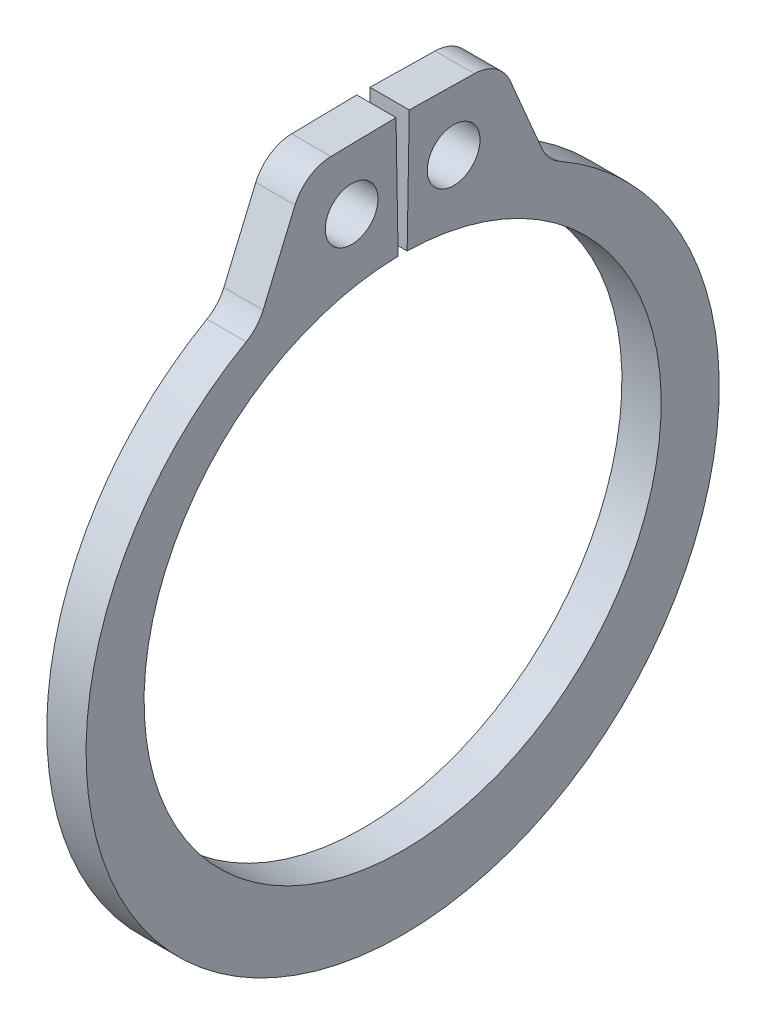
ISO-10303-21;
HEADER;
FILE_DESCRIPTION(('STEP AP214'),'2;1');
FILE_NAME('part.step','',(''),(''),'','','');
FILE_SCHEMA(('AUTOMOTIVE_DESIGN { 1 0 10303 214 1 1 1 1 }'));
ENDSEC;
DATA;
#1=APPLICATION_CONTEXT('core data for automotive mechanical design processes');
#2=APPLICATION_PROTOCOL_DEFINITION('international standard','automotive_design',2000,#1);
#3=PRODUCT_CONTEXT('',#1,'mechanical');
#4=PRODUCT('Part','Part','',(#3));
#5=PRODUCT_RELATED_PRODUCT_CATEGORY('part','',(#4));
#6=PRODUCT_DEFINITION_FORMATION('','',#4);
#7=PRODUCT_DEFINITION_CONTEXT('part definition',#1,'design');
#8=PRODUCT_DEFINITION('design','',#6,#7);
#9=PRODUCT_DEFINITION_SHAPE('','',#8);
#10=(LENGTH_UNIT() NAMED_UNIT(*) SI_UNIT(.MILLI.,.METRE.));
#11=(NAMED_UNIT(*) PLANE_ANGLE_UNIT() SI_UNIT($,.RADIAN.));
#12=(NAMED_UNIT(*) SI_UNIT($,.STERADIAN.) SOLID_ANGLE_UNIT());
#13=UNCERTAINTY_MEASURE_WITH_UNIT(LENGTH_MEASURE(1.E-05),#10,'distance_accuracy_value','');
#14=(GEOMETRIC_REPRESENTATION_CONTEXT(3) GLOBAL_UNCERTAINTY_ASSIGNED_CONTEXT((#13)) GLOBAL_UNIT_ASSIGNED_CONTEXT((#10,
#11,#12)) REPRESENTATION_CONTEXT('',''));
#15=CARTESIAN_POINT('',(0.,0.,0.));
#16=DIRECTION('',(0.,0.,1.));
#17=DIRECTION('',(1.,0.,0.));
#18=AXIS2_PLACEMENT_3D('',#15,#16,#17);
#19=CARTESIAN_POINT('',(0.4445,0.,0.));
#20=DIRECTION('',(1.,0.,0.));
#21=DIRECTION('',(0.,0.,-1.));
#22=AXIS2_PLACEMENT_3D('',#19,#20,#21);
#23=PLANE('',#22);
#24=CARTESIAN_POINT('',(0.4445,7.20724610900658,1.15465964864512));
#25=DIRECTION('',(1.,0.,0.));
#26=DIRECTION('',(0.,0.,-1.));
#27=AXIS2_PLACEMENT_3D('',#24,#25,#26);
#28=CIRCLE('',#27,0.5969);
#29=CARTESIAN_POINT('',(0.4445,7.20724610900658,0.557759648645124));
#30=VERTEX_POINT('',#29);
#31=EDGE_CURVE('E223',#30,#30,#28,.T.);
#32=ORIENTED_EDGE('',*,*,#31,.F.);
#33=EDGE_LOOP('',(#32));
#34=FACE_BOUND('',#33,.T.);
#35=DIRECTION('',(0.,-0.01745240643729,0.999847695156391));
#36=VECTOR('',#35,1.);
#37=CARTESIAN_POINT('',(0.4445,8.59659049818515,0.15005404530712));
#38=LINE('',#37,#36);
#39=CARTESIAN_POINT('',(0.4445,8.59659049818515,0.15005404530712));
#40=VERTEX_POINT('',#39);
#41=CARTESIAN_POINT('',(0.4445,8.5708933863481,1.62224059647238));
#42=VERTEX_POINT('',#41);
#43=EDGE_CURVE('E135',#40,#42,#38,.T.);
#44=ORIENTED_EDGE('',*,*,#43,.T.);
#45=CARTESIAN_POINT('',(0.4445,7.66933071962558,1.60650376158788));
#46=DIRECTION('',(1.,0.,0.));
#47=DIRECTION('',(0.,0.,-1.));
#48=AXIS2_PLACEMENT_3D('',#45,#46,#47);
#49=CIRCLE('',#48,0.9017);
#50=CARTESIAN_POINT('',(0.4445,8.02240621636442,2.43620285379096));
#51=VERTEX_POINT('',#50);
#52=EDGE_CURVE('E176',#42,#51,#49,.T.);
#53=ORIENTED_EDGE('',*,*,#52,.T.);
#54=DIRECTION('',(0.,-0.920149819455566,0.391566481910656));
#55=VECTOR('',#54,1.);
#56=CARTESIAN_POINT('',(0.4445,8.56068391718107,2.20714069332188));
#57=LINE('',#56,#55);
#58=CARTESIAN_POINT('',(0.4445,6.32616456625773,3.15803245301383));
#59=VERTEX_POINT('',#58);
#60=EDGE_CURVE('E215',#51,#59,#57,.T.);
#61=ORIENTED_EDGE('',*,*,#60,.T.);
#62=CARTESIAN_POINT('',(0.4445,6.67924006299657,3.98773154521692));
#63=DIRECTION('',(1.,0.,0.));
#64=DIRECTION('',(0.,0.,-1.));
#65=AXIS2_PLACEMENT_3D('',#62,#63,#64);
#66=CIRCLE('',#65,0.9017);
#67=CARTESIAN_POINT('',(0.4445,5.89530863003733,3.54218199868087));
#68=VERTEX_POINT('',#67);
#69=EDGE_CURVE('E183',#59,#68,#66,.F.);
#70=ORIENTED_EDGE('',*,*,#69,.T.);
#71=CARTESIAN_POINT('',(0.4445,-0.337057291142251,0.));
#72=DIRECTION('',(1.,0.,0.));
#73=DIRECTION('',(0.,0.,-1.));
#74=AXIS2_PLACEMENT_3D('',#71,#72,#73);
#75=CIRCLE('',#74,7.16864270885775);
#76=CARTESIAN_POINT('',(0.4445,5.89530863003733,-3.54218199868087));
#77=VERTEX_POINT('',#76);
#78=EDGE_CURVE('E208',#68,#77,#75,.T.);
#79=ORIENTED_EDGE('',*,*,#78,.T.);
#80=CARTESIAN_POINT('',(0.4445,6.67924006299657,-3.98773154521692));
#81=DIRECTION('',(1.,0.,0.));
#82=DIRECTION('',(0.,0.,-1.));
#83=AXIS2_PLACEMENT_3D('',#80,#81,#82);
#84=CIRCLE('',#83,0.9017);
#85=CARTESIAN_POINT('',(0.4445,6.32616456625773,-3.15803245301383));
#86=VERTEX_POINT('',#85);
#87=EDGE_CURVE('E11',#77,#86,#84,.F.);
#88=ORIENTED_EDGE('',*,*,#87,.T.);
#89=DIRECTION('',(0.,0.920149819455566,0.391566481910656));
#90=VECTOR('',#89,1.);
#91=CARTESIAN_POINT('',(0.4445,8.56068391718107,-2.20714069332188));
#92=LINE('',#91,#90);
#93=CARTESIAN_POINT('',(0.4445,8.02240621636442,-2.43620285379096));
#94=VERTEX_POINT('',#93);
#95=EDGE_CURVE('E207',#86,#94,#92,.T.);
#96=ORIENTED_EDGE('',*,*,#95,.T.);
#97=CARTESIAN_POINT('',(0.4445,7.66933071962558,-1.60650376158788));
#98=DIRECTION('',(1.,0.,0.));
#99=DIRECTION('',(0.,0.,-1.));
#100=AXIS2_PLACEMENT_3D('',#97,#98,#99);
#101=CIRCLE('',#100,0.9017);
#102=CARTESIAN_POINT('',(0.4445,8.5708933863481,-1.62224059647238));
#103=VERTEX_POINT('',#102);
#104=EDGE_CURVE('E51',#94,#103,#101,.T.);
#105=ORIENTED_EDGE('',*,*,#104,.T.);
#106=DIRECTION('',(0.,0.01745240643729,0.999847695156391));
#107=VECTOR('',#106,1.);
#108=CARTESIAN_POINT('',(0.4445,8.59659049818515,-0.15005404530712));
#109=LINE('',#108,#107);
#110=CARTESIAN_POINT('',(0.4445,8.59659049818515,-0.15005404530712));
#111=VERTEX_POINT('',#110);
#112=EDGE_CURVE('E212',#103,#111,#109,.T.);
#113=ORIENTED_EDGE('',*,*,#112,.T.);
#114=DIRECTION('',(0.,-0.999847695156391,0.0174524064372833));
#115=VECTOR('',#114,1.);
#116=CARTESIAN_POINT('',(0.4445,5.85380830083213,-0.102178603968365));
#117=LINE('',#116,#115);
#118=CARTESIAN_POINT('',(0.4445,5.85380830083213,-0.102178603968365));
#119=VERTEX_POINT('',#118);
#120=EDGE_CURVE('E141',#111,#119,#117,.T.);
#121=ORIENTED_EDGE('',*,*,#120,.T.);
#122=CARTESIAN_POINT('',(0.4445,0.,0.));
#123=DIRECTION('',(-1.,0.,0.));
#124=DIRECTION('',(0.,0.,-1.));
#125=AXIS2_PLACEMENT_3D('',#122,#123,#124);
#126=CIRCLE('',#125,5.8547);
#127=CARTESIAN_POINT('',(0.4445,5.85380830083213,0.102178603968365));
#128=VERTEX_POINT('',#127);
#129=EDGE_CURVE('E136',#119,#128,#126,.T.);
#130=ORIENTED_EDGE('',*,*,#129,.T.);
#131=DIRECTION('',(0.,0.999847695156391,0.0174524064372833));
#132=VECTOR('',#131,1.);
#133=CARTESIAN_POINT('',(0.4445,5.85380830083213,0.102178603968365));
#134=LINE('',#133,#132);
#135=EDGE_CURVE('E127',#128,#40,#134,.T.);
#136=ORIENTED_EDGE('',*,*,#135,.T.);
#137=EDGE_LOOP('',(#44,#53,#61,#70,#79,#88,#96,#105,#113,#121,#130,#136));
#138=FACE_BOUND('',#137,.T.);
#139=CARTESIAN_POINT('',(0.4445,7.20724610900658,-1.15465964864512));
#140=DIRECTION('',(1.,0.,0.));
#141=DIRECTION('',(0.,0.,-1.));
#142=AXIS2_PLACEMENT_3D('',#139,#140,#141);
#143=CIRCLE('',#142,0.5969);
#144=CARTESIAN_POINT('',(0.4445,7.20724610900658,-1.75155964864512));
#145=VERTEX_POINT('',#144);
#146=EDGE_CURVE('E249',#145,#145,#143,.T.);
#147=ORIENTED_EDGE('',*,*,#146,.F.);
#148=EDGE_LOOP('',(#147));
#149=FACE_BOUND('',#148,.T.);
#150=ADVANCED_FACE('F36',(#34,#138,#149),#23,.T.);
#151=CARTESIAN_POINT('',(-0.4445,0.,0.));
#152=DIRECTION('',(1.,0.,0.));
#153=DIRECTION('',(0.,0.,-1.));
#154=AXIS2_PLACEMENT_3D('',#151,#152,#153);
#155=PLANE('',#154);
#156=CARTESIAN_POINT('',(-0.4445,7.20724610900658,1.15465964864512));
#157=DIRECTION('',(1.,0.,0.));
#158=DIRECTION('',(0.,0.,-1.));
#159=AXIS2_PLACEMENT_3D('',#156,#157,#158);
#160=CIRCLE('',#159,0.5969);
#161=CARTESIAN_POINT('',(-0.4445,7.20724610900658,0.557759648645124));
#162=VERTEX_POINT('',#161);
#163=EDGE_CURVE('E246',#162,#162,#160,.T.);
#164=ORIENTED_EDGE('',*,*,#163,.T.);
#165=EDGE_LOOP('',(#164));
#166=FACE_BOUND('',#165,.T.);
#167=DIRECTION('',(0.,-0.920149819455566,0.391566481910656));
#168=VECTOR('',#167,1.);
#169=CARTESIAN_POINT('',(-0.4445,8.56068391718107,2.20714069332188));
#170=LINE('',#169,#168);
#171=CARTESIAN_POINT('',(-0.4445,8.02240621636442,2.43620285379096));
#172=VERTEX_POINT('',#171);
#173=CARTESIAN_POINT('',(-0.4445,6.32616456625773,3.15803245301383));
#174=VERTEX_POINT('',#173);
#175=EDGE_CURVE('E202',#172,#174,#170,.T.);
#176=ORIENTED_EDGE('',*,*,#175,.F.);
#177=CARTESIAN_POINT('',(-0.4445,7.66933071962558,1.60650376158788));
#178=DIRECTION('',(1.,0.,0.));
#179=DIRECTION('',(0.,0.,-1.));
#180=AXIS2_PLACEMENT_3D('',#177,#178,#179);
#181=CIRCLE('',#180,0.9017);
#182=CARTESIAN_POINT('',(-0.4445,8.5708933863481,1.62224059647238));
#183=VERTEX_POINT('',#182);
#184=EDGE_CURVE('E172',#172,#183,#181,.F.);
#185=ORIENTED_EDGE('',*,*,#184,.T.);
#186=DIRECTION('',(0.,-0.01745240643729,0.999847695156391));
#187=VECTOR('',#186,1.);
#188=CARTESIAN_POINT('',(-0.4445,8.59659049818515,0.15005404530712));
#189=LINE('',#188,#187);
#190=CARTESIAN_POINT('',(-0.4445,8.59659049818515,0.15005404530712));
#191=VERTEX_POINT('',#190);
#192=EDGE_CURVE('E225',#191,#183,#189,.T.);
#193=ORIENTED_EDGE('',*,*,#192,.F.);
#194=DIRECTION('',(0.,0.999847695156391,0.0174524064372833));
#195=VECTOR('',#194,1.);
#196=CARTESIAN_POINT('',(-0.4445,5.85380830083213,0.102178603968365));
#197=LINE('',#196,#195);
#198=CARTESIAN_POINT('',(-0.4445,5.85380830083213,0.102178603968365));
#199=VERTEX_POINT('',#198);
#200=EDGE_CURVE('E222',#199,#191,#197,.T.);
#201=ORIENTED_EDGE('',*,*,#200,.F.);
#202=CARTESIAN_POINT('',(-0.4445,0.,0.));
#203=DIRECTION('',(-1.,0.,0.));
#204=DIRECTION('',(0.,0.,-1.));
#205=AXIS2_PLACEMENT_3D('',#202,#203,#204);
#206=CIRCLE('',#205,5.8547);
#207=CARTESIAN_POINT('',(-0.4445,5.85380830083213,-0.102178603968365));
#208=VERTEX_POINT('',#207);
#209=EDGE_CURVE('E149',#208,#199,#206,.T.);
#210=ORIENTED_EDGE('',*,*,#209,.F.);
#211=DIRECTION('',(0.,-0.999847695156391,0.0174524064372833));
#212=VECTOR('',#211,1.);
#213=CARTESIAN_POINT('',(-0.4445,5.85380830083213,-0.102178603968365));
#214=LINE('',#213,#212);
#215=CARTESIAN_POINT('',(-0.4445,8.59659049818515,-0.15005404530712));
#216=VERTEX_POINT('',#215);
#217=EDGE_CURVE('E145',#216,#208,#214,.T.);
#218=ORIENTED_EDGE('',*,*,#217,.F.);
#219=DIRECTION('',(0.,0.01745240643729,0.999847695156391));
#220=VECTOR('',#219,1.);
#221=CARTESIAN_POINT('',(-0.4445,8.59659049818515,-0.15005404530712));
#222=LINE('',#221,#220);
#223=CARTESIAN_POINT('',(-0.4445,8.5708933863481,-1.62224059647238));
#224=VERTEX_POINT('',#223);
#225=EDGE_CURVE('E230',#224,#216,#222,.T.);
#226=ORIENTED_EDGE('',*,*,#225,.F.);
#227=CARTESIAN_POINT('',(-0.4445,7.66933071962558,-1.60650376158788));
#228=DIRECTION('',(1.,0.,0.));
#229=DIRECTION('',(0.,0.,-1.));
#230=AXIS2_PLACEMENT_3D('',#227,#228,#229);
#231=CIRCLE('',#230,0.9017);
#232=CARTESIAN_POINT('',(-0.4445,8.02240621636442,-2.43620285379096));
#233=VERTEX_POINT('',#232);
#234=EDGE_CURVE('E170',#224,#233,#231,.F.);
#235=ORIENTED_EDGE('',*,*,#234,.T.);
#236=DIRECTION('',(0.,0.920149819455566,0.391566481910656));
#237=VECTOR('',#236,1.);
#238=CARTESIAN_POINT('',(-0.4445,8.56068391718107,-2.20714069332188));
#239=LINE('',#238,#237);
#240=CARTESIAN_POINT('',(-0.4445,6.32616456625773,-3.15803245301383));
#241=VERTEX_POINT('',#240);
#242=EDGE_CURVE('E193',#241,#233,#239,.T.);
#243=ORIENTED_EDGE('',*,*,#242,.F.);
#244=CARTESIAN_POINT('',(-0.4445,6.67924006299657,-3.98773154521692));
#245=DIRECTION('',(1.,0.,0.));
#246=DIRECTION('',(0.,0.,-1.));
#247=AXIS2_PLACEMENT_3D('',#244,#245,#246);
#248=CIRCLE('',#247,0.9017);
#249=CARTESIAN_POINT('',(-0.4445,5.89530863003733,-3.54218199868087));
#250=VERTEX_POINT('',#249);
#251=EDGE_CURVE('E44',#241,#250,#248,.T.);
#252=ORIENTED_EDGE('',*,*,#251,.T.);
#253=CARTESIAN_POINT('',(-0.4445,-0.337057291142251,0.));
#254=DIRECTION('',(1.,0.,0.));
#255=DIRECTION('',(0.,0.,-1.));
#256=AXIS2_PLACEMENT_3D('',#253,#254,#255);
#257=CIRCLE('',#256,7.16864270885775);
#258=CARTESIAN_POINT('',(-0.4445,5.89530863003733,3.54218199868087));
#259=VERTEX_POINT('',#258);
#260=EDGE_CURVE('E191',#259,#250,#257,.T.);
#261=ORIENTED_EDGE('',*,*,#260,.F.);
#262=CARTESIAN_POINT('',(-0.4445,6.67924006299657,3.98773154521692));
#263=DIRECTION('',(1.,0.,0.));
#264=DIRECTION('',(0.,0.,-1.));
#265=AXIS2_PLACEMENT_3D('',#262,#263,#264);
#266=CIRCLE('',#265,0.9017);
#267=EDGE_CURVE('E181',#259,#174,#266,.T.);
#268=ORIENTED_EDGE('',*,*,#267,.T.);
#269=EDGE_LOOP('',(#176,#185,#193,#201,#210,#218,#226,#235,#243,#252,#261,#268));
#270=FACE_BOUND('',#269,.T.);
#271=CARTESIAN_POINT('',(-0.4445,7.20724610900658,-1.15465964864512));
#272=DIRECTION('',(1.,0.,0.));
#273=DIRECTION('',(0.,0.,-1.));
#274=AXIS2_PLACEMENT_3D('',#271,#272,#273);
#275=CIRCLE('',#274,0.5969);
#276=CARTESIAN_POINT('',(-0.4445,7.20724610900658,-1.75155964864512));
#277=VERTEX_POINT('',#276);
#278=EDGE_CURVE('E252',#277,#277,#275,.T.);
#279=ORIENTED_EDGE('',*,*,#278,.T.);
#280=EDGE_LOOP('',(#279));
#281=FACE_BOUND('',#280,.T.);
#282=ADVANCED_FACE('F189',(#166,#270,#281),#155,.F.);
#283=CARTESIAN_POINT('',(0.4445,0.,0.));
#284=DIRECTION('',(-1.,0.,0.));
#285=DIRECTION('',(0.,0.,1.));
#286=AXIS2_PLACEMENT_3D('',#283,#284,#285);
#287=CYLINDRICAL_SURFACE('',#286,5.8547);
#288=ORIENTED_EDGE('',*,*,#209,.T.);
#289=DIRECTION('',(-1.,0.,0.));
#290=VECTOR('',#289,1.);
#291=CARTESIAN_POINT('',(0.4445,5.85380830083213,0.102178603968365));
#292=LINE('',#291,#290);
#293=EDGE_CURVE('E131',#128,#199,#292,.T.);
#294=ORIENTED_EDGE('',*,*,#293,.F.);
#295=ORIENTED_EDGE('',*,*,#129,.F.);
#296=DIRECTION('',(-1.,0.,0.));
#297=VECTOR('',#296,1.);
#298=CARTESIAN_POINT('',(0.4445,5.85380830083213,-0.102178603968365));
#299=LINE('',#298,#297);
#300=EDGE_CURVE('E220',#119,#208,#299,.T.);
#301=ORIENTED_EDGE('',*,*,#300,.T.);
#302=EDGE_LOOP('',(#288,#294,#295,#301));
#303=FACE_BOUND('',#302,.T.);
#304=ADVANCED_FACE('F147',(#303),#287,.F.);
#305=CARTESIAN_POINT('',(0.4445,5.85380830083213,0.102178603968365));
#306=DIRECTION('',(0.,-0.0174524064372833,0.999847695156391));
#307=DIRECTION('',(0.,-0.999847695156391,-0.0174524064372833));
#308=AXIS2_PLACEMENT_3D('',#305,#306,#307);
#309=PLANE('',#308);
#310=ORIENTED_EDGE('',*,*,#200,.T.);
#311=DIRECTION('',(-1.,0.,0.));
#312=VECTOR('',#311,1.);
#313=CARTESIAN_POINT('',(0.4445,8.59659049818515,0.15005404530712));
#314=LINE('',#313,#312);
#315=EDGE_CURVE('E134',#40,#191,#314,.T.);
#316=ORIENTED_EDGE('',*,*,#315,.F.);
#317=ORIENTED_EDGE('',*,*,#135,.F.);
#318=ORIENTED_EDGE('',*,*,#293,.T.);
#319=EDGE_LOOP('',(#310,#316,#317,#318));
#320=FACE_BOUND('',#319,.T.);
#321=ADVANCED_FACE('F129',(#320),#309,.F.);
#322=CARTESIAN_POINT('',(0.4445,8.59659049818515,0.15005404530712));
#323=DIRECTION('',(0.,-0.999847695156391,-0.01745240643729));
#324=DIRECTION('',(0.,0.01745240643729,-0.999847695156391));
#325=AXIS2_PLACEMENT_3D('',#322,#323,#324);
#326=PLANE('',#325);
#327=ORIENTED_EDGE('',*,*,#192,.T.);
#328=DIRECTION('',(-1.,0.,0.));
#329=VECTOR('',#328,1.);
#330=CARTESIAN_POINT('',(0.4445,8.5708933863481,1.62224059647238));
#331=LINE('',#330,#329);
#332=EDGE_CURVE('E59',#183,#42,#331,.F.);
#333=ORIENTED_EDGE('',*,*,#332,.T.);
#334=ORIENTED_EDGE('',*,*,#43,.F.);
#335=ORIENTED_EDGE('',*,*,#315,.T.);
#336=EDGE_LOOP('',(#327,#333,#334,#335));
#337=FACE_BOUND('',#336,.T.);
#338=ADVANCED_FACE('F241',(#337),#326,.F.);
#339=CARTESIAN_POINT('',(0.4445,8.56068391718107,2.20714069332188));
#340=DIRECTION('',(0.,-0.391566481910657,-0.920149819455567));
#341=DIRECTION('',(0.,0.920149819455567,-0.391566481910657));
#342=AXIS2_PLACEMENT_3D('',#339,#340,#341);
#343=PLANE('',#342);
#344=ORIENTED_EDGE('',*,*,#175,.T.);
#345=DIRECTION('',(1.,0.,0.));
#346=VECTOR('',#345,1.);
#347=CARTESIAN_POINT('',(0.4445,6.32616456625773,3.15803245301383));
#348=LINE('',#347,#346);
#349=EDGE_CURVE('E163',#174,#59,#348,.T.);
#350=ORIENTED_EDGE('',*,*,#349,.T.);
#351=ORIENTED_EDGE('',*,*,#60,.F.);
#352=DIRECTION('',(-1.,0.,0.));
#353=VECTOR('',#352,1.);
#354=CARTESIAN_POINT('',(0.4445,8.02240621636442,2.43620285379096));
#355=LINE('',#354,#353);
#356=EDGE_CURVE('E160',#51,#172,#355,.T.);
#357=ORIENTED_EDGE('',*,*,#356,.T.);
#358=EDGE_LOOP('',(#344,#350,#351,#357));
#359=FACE_BOUND('',#358,.T.);
#360=ADVANCED_FACE('F282',(#359),#343,.F.);
#361=CARTESIAN_POINT('',(0.4445,-0.337057291142251,0.));
#362=DIRECTION('',(-1.,0.,0.));
#363=DIRECTION('',(0.,0.,1.));
#364=AXIS2_PLACEMENT_3D('',#361,#362,#363);
#365=CYLINDRICAL_SURFACE('',#364,7.16864270885775);
#366=ORIENTED_EDGE('',*,*,#78,.F.);
#367=DIRECTION('',(-1.,0.,0.));
#368=VECTOR('',#367,1.);
#369=CARTESIAN_POINT('',(0.4445,5.89530863003733,3.54218199868087));
#370=LINE('',#369,#368);
#371=EDGE_CURVE('E152',#68,#259,#370,.T.);
#372=ORIENTED_EDGE('',*,*,#371,.T.);
#373=ORIENTED_EDGE('',*,*,#260,.T.);
#374=DIRECTION('',(-1.,0.,0.));
#375=VECTOR('',#374,1.);
#376=CARTESIAN_POINT('',(0.4445,5.89530863003733,-3.54218199868087));
#377=LINE('',#376,#375);
#378=EDGE_CURVE('E150',#250,#77,#377,.F.);
#379=ORIENTED_EDGE('',*,*,#378,.T.);
#380=EDGE_LOOP('',(#366,#372,#373,#379));
#381=FACE_BOUND('',#380,.T.);
#382=ADVANCED_FACE('F199',(#381),#365,.T.);
#383=CARTESIAN_POINT('',(0.4445,8.56068391718107,-2.20714069332188));
#384=DIRECTION('',(0.,-0.391566481910657,0.920149819455567));
#385=DIRECTION('',(0.,-0.920149819455567,-0.391566481910657));
#386=AXIS2_PLACEMENT_3D('',#383,#384,#385);
#387=PLANE('',#386);
#388=ORIENTED_EDGE('',*,*,#95,.F.);
#389=DIRECTION('',(1.,0.,0.));
#390=VECTOR('',#389,1.);
#391=CARTESIAN_POINT('',(-0.4445,6.32616456625773,-3.15803245301383));
#392=LINE('',#391,#390);
#393=EDGE_CURVE('E167',#86,#241,#392,.F.);
#394=ORIENTED_EDGE('',*,*,#393,.T.);
#395=ORIENTED_EDGE('',*,*,#242,.T.);
#396=DIRECTION('',(-1.,0.,0.));
#397=VECTOR('',#396,1.);
#398=CARTESIAN_POINT('',(0.4445,8.02240621636442,-2.43620285379096));
#399=LINE('',#398,#397);
#400=EDGE_CURVE('E165',#233,#94,#399,.F.);
#401=ORIENTED_EDGE('',*,*,#400,.T.);
#402=EDGE_LOOP('',(#388,#394,#395,#401));
#403=FACE_BOUND('',#402,.T.);
#404=ADVANCED_FACE('F210',(#403),#387,.F.);
#405=CARTESIAN_POINT('',(0.4445,8.59659049818515,-0.15005404530712));
#406=DIRECTION('',(0.,-0.999847695156391,0.01745240643729));
#407=DIRECTION('',(0.,-0.01745240643729,-0.999847695156391));
#408=AXIS2_PLACEMENT_3D('',#405,#406,#407);
#409=PLANE('',#408);
#410=ORIENTED_EDGE('',*,*,#112,.F.);
#411=DIRECTION('',(-1.,0.,0.));
#412=VECTOR('',#411,1.);
#413=CARTESIAN_POINT('',(0.4445,8.5708933863481,-1.62224059647238));
#414=LINE('',#413,#412);
#415=EDGE_CURVE('E178',#103,#224,#414,.T.);
#416=ORIENTED_EDGE('',*,*,#415,.T.);
#417=ORIENTED_EDGE('',*,*,#225,.T.);
#418=DIRECTION('',(-1.,0.,0.));
#419=VECTOR('',#418,1.);
#420=CARTESIAN_POINT('',(0.4445,8.59659049818515,-0.15005404530712));
#421=LINE('',#420,#419);
#422=EDGE_CURVE('E154',#111,#216,#421,.T.);
#423=ORIENTED_EDGE('',*,*,#422,.F.);
#424=EDGE_LOOP('',(#410,#416,#417,#423));
#425=FACE_BOUND('',#424,.T.);
#426=ADVANCED_FACE('F275',(#425),#409,.F.);
#427=CARTESIAN_POINT('',(0.4445,5.85380830083213,-0.102178603968365));
#428=DIRECTION('',(0.,-0.0174524064372833,-0.999847695156391));
#429=DIRECTION('',(0.,0.999847695156391,-0.0174524064372833));
#430=AXIS2_PLACEMENT_3D('',#427,#428,#429);
#431=PLANE('',#430);
#432=ORIENTED_EDGE('',*,*,#217,.T.);
#433=ORIENTED_EDGE('',*,*,#300,.F.);
#434=ORIENTED_EDGE('',*,*,#120,.F.);
#435=ORIENTED_EDGE('',*,*,#422,.T.);
#436=EDGE_LOOP('',(#432,#433,#434,#435));
#437=FACE_BOUND('',#436,.T.);
#438=ADVANCED_FACE('F237',(#437),#431,.F.);
#439=CARTESIAN_POINT('',(0.4445,7.20724610900658,1.15465964864512));
#440=DIRECTION('',(-1.,0.,0.));
#441=DIRECTION('',(0.,0.,1.));
#442=AXIS2_PLACEMENT_3D('',#439,#440,#441);
#443=CYLINDRICAL_SURFACE('',#442,0.5969);
#444=ORIENTED_EDGE('',*,*,#31,.T.);
#445=EDGE_LOOP('',(#444));
#446=FACE_BOUND('',#445,.T.);
#447=ORIENTED_EDGE('',*,*,#163,.F.);
#448=EDGE_LOOP('',(#447));
#449=FACE_BOUND('',#448,.T.);
#450=ADVANCED_FACE('F270',(#446,#449),#443,.F.);
#451=CARTESIAN_POINT('',(0.4445,7.20724610900658,-1.15465964864512));
#452=DIRECTION('',(-1.,0.,0.));
#453=DIRECTION('',(0.,0.,1.));
#454=AXIS2_PLACEMENT_3D('',#451,#452,#453);
#455=CYLINDRICAL_SURFACE('',#454,0.5969);
#456=ORIENTED_EDGE('',*,*,#146,.T.);
#457=EDGE_LOOP('',(#456));
#458=FACE_BOUND('',#457,.T.);
#459=ORIENTED_EDGE('',*,*,#278,.F.);
#460=EDGE_LOOP('',(#459));
#461=FACE_BOUND('',#460,.T.);
#462=ADVANCED_FACE('F258',(#458,#461),#455,.F.);
#463=CARTESIAN_POINT('',(0.4445,6.67924006299657,3.98773154521692));
#464=DIRECTION('',(-1.,0.,0.));
#465=DIRECTION('',(0.,0.,1.));
#466=AXIS2_PLACEMENT_3D('',#463,#464,#465);
#467=CYLINDRICAL_SURFACE('',#466,0.9017);
#468=ORIENTED_EDGE('',*,*,#69,.F.);
#469=ORIENTED_EDGE('',*,*,#349,.F.);
#470=ORIENTED_EDGE('',*,*,#267,.F.);
#471=ORIENTED_EDGE('',*,*,#371,.F.);
#472=EDGE_LOOP('',(#468,#469,#470,#471));
#473=FACE_BOUND('',#472,.T.);
#474=ADVANCED_FACE('F292',(#473),#467,.F.);
#475=CARTESIAN_POINT('',(0.4445,6.67924006299657,-3.98773154521692));
#476=DIRECTION('',(-1.,0.,0.));
#477=DIRECTION('',(0.,0.,1.));
#478=AXIS2_PLACEMENT_3D('',#475,#476,#477);
#479=CYLINDRICAL_SURFACE('',#478,0.9017);
#480=ORIENTED_EDGE('',*,*,#87,.F.);
#481=ORIENTED_EDGE('',*,*,#378,.F.);
#482=ORIENTED_EDGE('',*,*,#251,.F.);
#483=ORIENTED_EDGE('',*,*,#393,.F.);
#484=EDGE_LOOP('',(#480,#481,#482,#483));
#485=FACE_BOUND('',#484,.T.);
#486=ADVANCED_FACE('F205',(#485),#479,.F.);
#487=CARTESIAN_POINT('',(0.4445,7.66933071962558,1.60650376158788));
#488=DIRECTION('',(-1.,0.,0.));
#489=DIRECTION('',(0.,0.,1.));
#490=AXIS2_PLACEMENT_3D('',#487,#488,#489);
#491=CYLINDRICAL_SURFACE('',#490,0.9017);
#492=ORIENTED_EDGE('',*,*,#52,.F.);
#493=ORIENTED_EDGE('',*,*,#332,.F.);
#494=ORIENTED_EDGE('',*,*,#184,.F.);
#495=ORIENTED_EDGE('',*,*,#356,.F.);
#496=EDGE_LOOP('',(#492,#493,#494,#495));
#497=FACE_BOUND('',#496,.T.);
#498=ADVANCED_FACE('F297',(#497),#491,.T.);
#499=CARTESIAN_POINT('',(0.4445,7.66933071962558,-1.60650376158788));
#500=DIRECTION('',(-1.,0.,0.));
#501=DIRECTION('',(0.,0.,1.));
#502=AXIS2_PLACEMENT_3D('',#499,#500,#501);
#503=CYLINDRICAL_SURFACE('',#502,0.9017);
#504=ORIENTED_EDGE('',*,*,#104,.F.);
#505=ORIENTED_EDGE('',*,*,#400,.F.);
#506=ORIENTED_EDGE('',*,*,#234,.F.);
#507=ORIENTED_EDGE('',*,*,#415,.F.);
#508=EDGE_LOOP('',(#504,#505,#506,#507));
#509=FACE_BOUND('',#508,.T.);
#510=ADVANCED_FACE('F38',(#509),#503,.T.);
#511=CLOSED_SHELL('',(#150,#282,#304,#321,#338,#360,#382,#404,#426,#438,#450,#462,#474,#486,
#498,#510));
#512=MANIFOLD_SOLID_BREP('B2',#511);
#513=ADVANCED_BREP_SHAPE_REPRESENTATION('',(#18,#512),#14);
#514=SHAPE_DEFINITION_REPRESENTATION(#9,#513);
ENDSEC;
END-ISO-10303-21;
